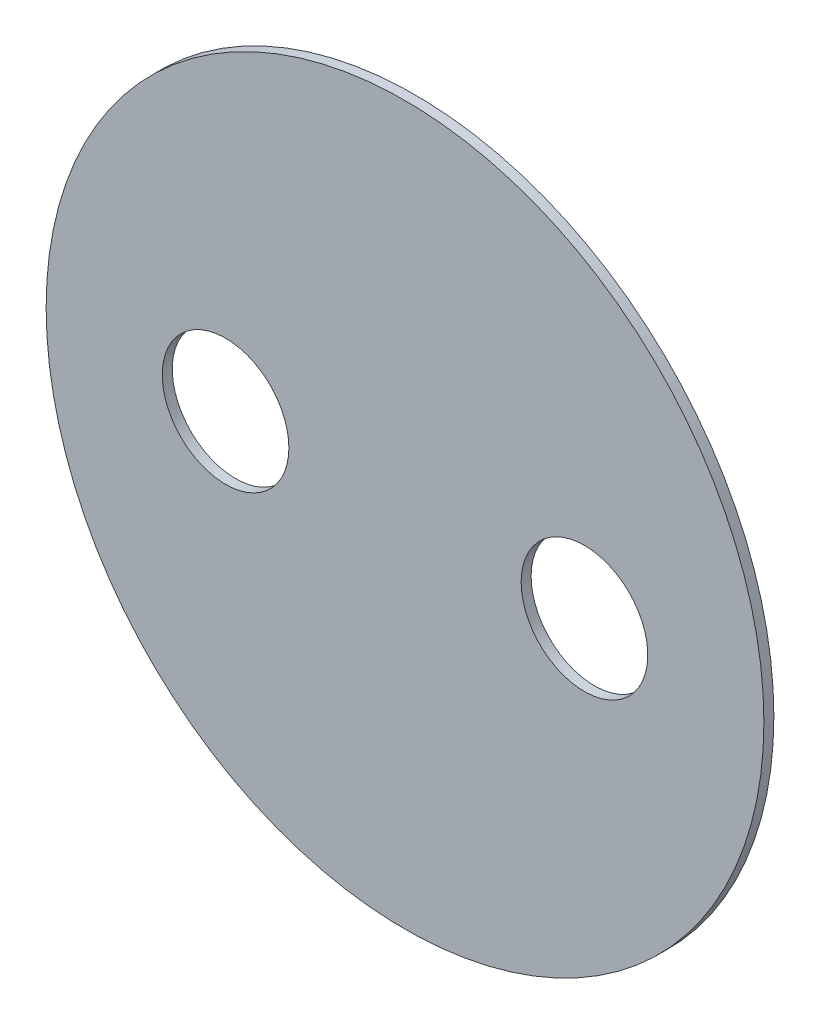
ISO-10303-21;
HEADER;
FILE_DESCRIPTION(('STEP AP214'),'2;1');
FILE_NAME('part.step','',(''),(''),'','','');
FILE_SCHEMA(('AUTOMOTIVE_DESIGN { 1 0 10303 214 1 1 1 1 }'));
ENDSEC;
DATA;
#1=APPLICATION_CONTEXT('core data for automotive mechanical design processes');
#2=APPLICATION_PROTOCOL_DEFINITION('international standard','automotive_design',2000,#1);
#3=PRODUCT_CONTEXT('',#1,'mechanical');
#4=PRODUCT('Part','Part','',(#3));
#5=PRODUCT_RELATED_PRODUCT_CATEGORY('part','',(#4));
#6=PRODUCT_DEFINITION_FORMATION('','',#4);
#7=PRODUCT_DEFINITION_CONTEXT('part definition',#1,'design');
#8=PRODUCT_DEFINITION('design','',#6,#7);
#9=PRODUCT_DEFINITION_SHAPE('','',#8);
#10=(LENGTH_UNIT() NAMED_UNIT(*) SI_UNIT(.MILLI.,.METRE.));
#11=(NAMED_UNIT(*) PLANE_ANGLE_UNIT() SI_UNIT($,.RADIAN.));
#12=(NAMED_UNIT(*) SI_UNIT($,.STERADIAN.) SOLID_ANGLE_UNIT());
#13=UNCERTAINTY_MEASURE_WITH_UNIT(LENGTH_MEASURE(1.E-05),#10,'distance_accuracy_value','');
#14=(GEOMETRIC_REPRESENTATION_CONTEXT(3) GLOBAL_UNCERTAINTY_ASSIGNED_CONTEXT((#13)) GLOBAL_UNIT_ASSIGNED_CONTEXT((#10,
#11,#12)) REPRESENTATION_CONTEXT('',''));
#15=CARTESIAN_POINT('',(0.,0.,0.));
#16=DIRECTION('',(0.,0.,1.));
#17=DIRECTION('',(1.,0.,0.));
#18=AXIS2_PLACEMENT_3D('',#15,#16,#17);
#19=CARTESIAN_POINT('',(0.,0.,1.));
#20=DIRECTION('',(0.,0.,1.));
#21=DIRECTION('',(1.,0.,0.));
#22=AXIS2_PLACEMENT_3D('',#19,#20,#21);
#23=PLANE('',#22);
#24=CARTESIAN_POINT('',(-18.,0.,1.));
#25=DIRECTION('',(0.,0.,1.));
#26=DIRECTION('',(1.,0.,0.));
#27=AXIS2_PLACEMENT_3D('',#24,#25,#26);
#28=CIRCLE('',#27,6.35);
#29=CARTESIAN_POINT('',(-11.65,0.,1.));
#30=VERTEX_POINT('',#29);
#31=EDGE_CURVE('E56',#30,#30,#28,.T.);
#32=ORIENTED_EDGE('',*,*,#31,.F.);
#33=EDGE_LOOP('',(#32));
#34=FACE_BOUND('',#33,.T.);
#35=CARTESIAN_POINT('',(0.,0.,1.));
#36=DIRECTION('',(0.,0.,1.));
#37=DIRECTION('',(1.,0.,0.));
#38=AXIS2_PLACEMENT_3D('',#35,#36,#37);
#39=CIRCLE('',#38,36.);
#40=CARTESIAN_POINT('',(36.,0.,1.));
#41=VERTEX_POINT('',#40);
#42=EDGE_CURVE('E10',#41,#41,#39,.T.);
#43=ORIENTED_EDGE('',*,*,#42,.T.);
#44=EDGE_LOOP('',(#43));
#45=FACE_BOUND('',#44,.T.);
#46=CARTESIAN_POINT('',(18.,0.,1.));
#47=DIRECTION('',(0.,0.,1.));
#48=DIRECTION('',(-1.,0.,0.));
#49=AXIS2_PLACEMENT_3D('',#46,#47,#48);
#50=CIRCLE('',#49,6.35);
#51=CARTESIAN_POINT('',(11.65,0.,1.));
#52=VERTEX_POINT('',#51);
#53=EDGE_CURVE('E62',#52,#52,#50,.T.);
#54=ORIENTED_EDGE('',*,*,#53,.F.);
#55=EDGE_LOOP('',(#54));
#56=FACE_BOUND('',#55,.T.);
#57=ADVANCED_FACE('F43',(#34,#45,#56),#23,.T.);
#58=CARTESIAN_POINT('',(0.,0.,0.));
#59=DIRECTION('',(0.,0.,1.));
#60=DIRECTION('',(1.,0.,0.));
#61=AXIS2_PLACEMENT_3D('',#58,#59,#60);
#62=PLANE('',#61);
#63=CARTESIAN_POINT('',(0.,0.,0.));
#64=DIRECTION('',(0.,0.,1.));
#65=DIRECTION('',(1.,0.,0.));
#66=AXIS2_PLACEMENT_3D('',#63,#64,#65);
#67=CIRCLE('',#66,36.);
#68=CARTESIAN_POINT('',(36.,0.,0.));
#69=VERTEX_POINT('',#68);
#70=EDGE_CURVE('E47',#69,#69,#67,.T.);
#71=ORIENTED_EDGE('',*,*,#70,.F.);
#72=EDGE_LOOP('',(#71));
#73=FACE_BOUND('',#72,.T.);
#74=CARTESIAN_POINT('',(-18.,0.,0.));
#75=DIRECTION('',(0.,0.,1.));
#76=DIRECTION('',(1.,0.,0.));
#77=AXIS2_PLACEMENT_3D('',#74,#75,#76);
#78=CIRCLE('',#77,6.35);
#79=CARTESIAN_POINT('',(-11.65,0.,0.));
#80=VERTEX_POINT('',#79);
#81=EDGE_CURVE('E58',#80,#80,#78,.T.);
#82=ORIENTED_EDGE('',*,*,#81,.T.);
#83=EDGE_LOOP('',(#82));
#84=FACE_BOUND('',#83,.T.);
#85=CARTESIAN_POINT('',(18.,0.,0.));
#86=DIRECTION('',(0.,0.,1.));
#87=DIRECTION('',(-1.,0.,0.));
#88=AXIS2_PLACEMENT_3D('',#85,#86,#87);
#89=CIRCLE('',#88,6.35);
#90=CARTESIAN_POINT('',(11.65,0.,0.));
#91=VERTEX_POINT('',#90);
#92=EDGE_CURVE('E66',#91,#91,#89,.T.);
#93=ORIENTED_EDGE('',*,*,#92,.T.);
#94=EDGE_LOOP('',(#93));
#95=FACE_BOUND('',#94,.T.);
#96=ADVANCED_FACE('F78',(#73,#84,#95),#62,.F.);
#97=CARTESIAN_POINT('',(0.,0.,1.));
#98=DIRECTION('',(0.,0.,-1.));
#99=DIRECTION('',(-1.,0.,0.));
#100=AXIS2_PLACEMENT_3D('',#97,#98,#99);
#101=CYLINDRICAL_SURFACE('',#100,36.);
#102=ORIENTED_EDGE('',*,*,#42,.F.);
#103=EDGE_LOOP('',(#102));
#104=FACE_BOUND('',#103,.T.);
#105=ORIENTED_EDGE('',*,*,#70,.T.);
#106=EDGE_LOOP('',(#105));
#107=FACE_BOUND('',#106,.T.);
#108=ADVANCED_FACE('F45',(#104,#107),#101,.T.);
#109=CARTESIAN_POINT('',(-18.,0.,1.));
#110=DIRECTION('',(0.,0.,-1.));
#111=DIRECTION('',(-1.,0.,0.));
#112=AXIS2_PLACEMENT_3D('',#109,#110,#111);
#113=CYLINDRICAL_SURFACE('',#112,6.35);
#114=ORIENTED_EDGE('',*,*,#31,.T.);
#115=EDGE_LOOP('',(#114));
#116=FACE_BOUND('',#115,.T.);
#117=ORIENTED_EDGE('',*,*,#81,.F.);
#118=EDGE_LOOP('',(#117));
#119=FACE_BOUND('',#118,.T.);
#120=ADVANCED_FACE('F87',(#116,#119),#113,.F.);
#121=CARTESIAN_POINT('',(18.,0.,1.));
#122=DIRECTION('',(0.,0.,-1.));
#123=DIRECTION('',(-1.,0.,0.));
#124=AXIS2_PLACEMENT_3D('',#121,#122,#123);
#125=CYLINDRICAL_SURFACE('',#124,6.35);
#126=ORIENTED_EDGE('',*,*,#53,.T.);
#127=EDGE_LOOP('',(#126));
#128=FACE_BOUND('',#127,.T.);
#129=ORIENTED_EDGE('',*,*,#92,.F.);
#130=EDGE_LOOP('',(#129));
#131=FACE_BOUND('',#130,.T.);
#132=ADVANCED_FACE('F74',(#128,#131),#125,.F.);
#133=CLOSED_SHELL('',(#57,#96,#108,#120,#132));
#134=MANIFOLD_SOLID_BREP('B2',#133);
#135=ADVANCED_BREP_SHAPE_REPRESENTATION('',(#18,#134),#14);
#136=SHAPE_DEFINITION_REPRESENTATION(#9,#135);
ENDSEC;
END-ISO-10303-21;
